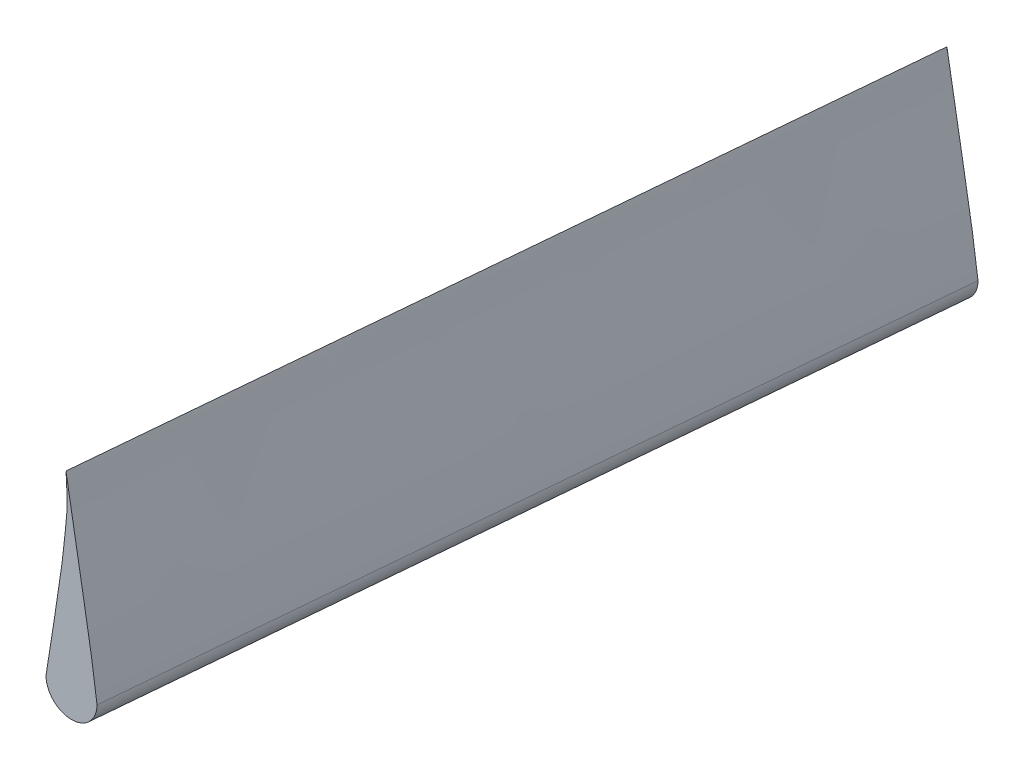
ISO-10303-21;
HEADER;
FILE_DESCRIPTION(('STEP AP214'),'2;1');
FILE_NAME('part.step','',(''),(''),'','','');
FILE_SCHEMA(('AUTOMOTIVE_DESIGN { 1 0 10303 214 1 1 1 1 }'));
ENDSEC;
DATA;
#1=APPLICATION_CONTEXT('core data for automotive mechanical design processes');
#2=APPLICATION_PROTOCOL_DEFINITION('international standard','automotive_design',2000,#1);
#3=PRODUCT_CONTEXT('',#1,'mechanical');
#4=PRODUCT('Part','Part','',(#3));
#5=PRODUCT_RELATED_PRODUCT_CATEGORY('part','',(#4));
#6=PRODUCT_DEFINITION_FORMATION('','',#4);
#7=PRODUCT_DEFINITION_CONTEXT('part definition',#1,'design');
#8=PRODUCT_DEFINITION('design','',#6,#7);
#9=PRODUCT_DEFINITION_SHAPE('','',#8);
#10=(LENGTH_UNIT() NAMED_UNIT(*) SI_UNIT(.MILLI.,.METRE.));
#11=(NAMED_UNIT(*) PLANE_ANGLE_UNIT() SI_UNIT($,.RADIAN.));
#12=(NAMED_UNIT(*) SI_UNIT($,.STERADIAN.) SOLID_ANGLE_UNIT());
#13=UNCERTAINTY_MEASURE_WITH_UNIT(LENGTH_MEASURE(1.E-05),#10,'distance_accuracy_value','');
#14=(GEOMETRIC_REPRESENTATION_CONTEXT(3) GLOBAL_UNCERTAINTY_ASSIGNED_CONTEXT((#13)) GLOBAL_UNIT_ASSIGNED_CONTEXT((#10,
#11,#12)) REPRESENTATION_CONTEXT('',''));
#15=CARTESIAN_POINT('',(0.,0.,0.));
#16=DIRECTION('',(0.,0.,1.));
#17=DIRECTION('',(1.,0.,0.));
#18=AXIS2_PLACEMENT_3D('',#15,#16,#17);
#19=CARTESIAN_POINT('',(15.8488055516127,1622.96621018541,0.));
#20=DIRECTION('',(0.,0.,-1.));
#21=DIRECTION('',(-1.,0.,0.));
#22=AXIS2_PLACEMENT_3D('',#19,#20,#21);
#23=PLANE('',#22);
#24=CARTESIAN_POINT('',(108.163111705416,1062.25747855031,0.));
#25=CARTESIAN_POINT('',(107.796490349262,1065.20905215608,0.));
#26=CARTESIAN_POINT('',(104.514218778771,1091.32278034132,0.));
#27=CARTESIAN_POINT('',(97.6922983253873,1140.53891503912,0.));
#28=CARTESIAN_POINT('',(86.8900465622131,1209.81552897301,0.));
#29=CARTESIAN_POINT('',(75.138452034244,1278.86712759581,0.));
#30=CARTESIAN_POINT('',(62.8377448113715,1348.12449752123,0.));
#31=CARTESIAN_POINT('',(50.6145480312206,1416.01854666511,0.));
#32=CARTESIAN_POINT('',(37.9388449649304,1488.40711009085,0.));
#33=CARTESIAN_POINT('',(28.1057432524615,1543.56861320653,0.));
#34=CARTESIAN_POINT('',(11.2614137888011,1662.85758330789,0.));
#35=CARTESIAN_POINT('',(21.4772260243616,1543.13407332135,0.));
#36=CARTESIAN_POINT('',(14.9162912804117,1487.3237579234,0.));
#37=CARTESIAN_POINT('',(8.69255205173735,1415.12664901814,0.));
#38=CARTESIAN_POINT('',(-0.773079201051988,1347.2963100016,0.));
#39=CARTESIAN_POINT('',(-10.5325328796301,1278.32468444548,0.));
#40=CARTESIAN_POINT('',(-21.5630755964598,1209.5037548012,0.));
#41=CARTESIAN_POINT('',(-32.4731551210363,1141.11506657572,0.));
#42=CARTESIAN_POINT('',(-40.1427423720363,1092.05030975213,0.));
#43=CARTESIAN_POINT('',(-44.1138653947144,1065.76999348616,0.));
#44=CARTESIAN_POINT('',(-44.6420176327897,1062.25747855031,0.));
#45=B_SPLINE_CURVE_WITH_KNOTS('',3,(#24,#25,#26,#27,#28,#29,#30,#31,#32,#33,#34,#35,#36,#37,#38,
#39,#40,#41,#42,#43,#44),.UNSPECIFIED.,.F.,.F.,(4,1,1,1,1,1,1,1,1,1,1,1,1,1,1,1,1,1,4),
(0.799626775710042,0.802790066661639,0.827618886372047,0.852471990587497,0.877337189985559,
0.902189617186733,0.927001991480165,0.951757738434166,0.976444336414281,1.00112539811414,
1.02571177010497,1.05026987366829,1.07486164910205,1.09903169356934,1.1240838565413,
1.14867833551307,1.17323020465844,1.19772082087589,1.20149862240409),.UNSPECIFIED.);
#46=CARTESIAN_POINT('',(108.163111705413,1062.25747855031,0.));
#47=VERTEX_POINT('',#46);
#48=CARTESIAN_POINT('',(-44.6420176327926,1062.25747855031,0.));
#49=VERTEX_POINT('',#48);
#50=EDGE_CURVE('E56',#47,#49,#45,.T.);
#51=ORIENTED_EDGE('',*,*,#50,.F.);
#52=CARTESIAN_POINT('',(31.7605470363104,1062.25747855031,0.));
#53=DIRECTION('',(0.,0.,1.));
#54=DIRECTION('',(1.,0.,0.));
#55=AXIS2_PLACEMENT_3D('',#52,#53,#54);
#56=CIRCLE('',#55,76.402564669103);
#57=EDGE_CURVE('E58',#49,#47,#56,.T.);
#58=ORIENTED_EDGE('',*,*,#57,.F.);
#59=EDGE_LOOP('',(#51,#58));
#60=FACE_BOUND('',#59,.T.);
#61=ADVANCED_FACE('F34',(#60),#23,.T.);
#62=CARTESIAN_POINT('',(18.2927195515977,1844.32718336245,2641.60000000434));
#63=DIRECTION('',(0.,0.,-1.));
#64=DIRECTION('',(-1.,0.,0.));
#65=AXIS2_PLACEMENT_3D('',#62,#63,#64);
#66=PLANE('',#65);
#67=CARTESIAN_POINT('',(110.607025705401,1283.61845172734,2641.60000000434));
#68=CARTESIAN_POINT('',(110.240404349247,1286.57002533312,2641.60000000434));
#69=CARTESIAN_POINT('',(106.958132778756,1312.68375351835,2641.60000000434));
#70=CARTESIAN_POINT('',(100.136212325372,1361.89988821616,2641.60000000434));
#71=CARTESIAN_POINT('',(89.3339605621982,1431.17650215005,2641.60000000434));
#72=CARTESIAN_POINT('',(77.582366034229,1500.22810077285,2641.60000000434));
#73=CARTESIAN_POINT('',(65.2816588113565,1569.48547069826,2641.60000000434));
#74=CARTESIAN_POINT('',(53.0584620312056,1637.37951984214,2641.60000000434));
#75=CARTESIAN_POINT('',(40.3827589649154,1709.76808326789,2641.60000000434));
#76=CARTESIAN_POINT('',(30.5496572524466,1764.92958638357,2641.60000000434));
#77=CARTESIAN_POINT('',(13.7053277887861,1884.21855648493,2641.60000000434));
#78=CARTESIAN_POINT('',(23.9211400243466,1764.49504649839,2641.60000000434));
#79=CARTESIAN_POINT('',(17.3602052803967,1708.68473110043,2641.60000000434));
#80=CARTESIAN_POINT('',(11.1364660517224,1636.48762219518,2641.60000000434));
#81=CARTESIAN_POINT('',(1.67083479893303,1568.65728317864,2641.60000000434));
#82=CARTESIAN_POINT('',(-8.08861887964504,1499.68565762252,2641.60000000434));
#83=CARTESIAN_POINT('',(-19.1191615964748,1430.86472797824,2641.60000000434));
#84=CARTESIAN_POINT('',(-30.0292411210512,1362.47603975276,2641.60000000434));
#85=CARTESIAN_POINT('',(-37.6988283720513,1313.41128292917,2641.60000000434));
#86=CARTESIAN_POINT('',(-41.6699513947293,1287.1309666632,2641.60000000434));
#87=CARTESIAN_POINT('',(-42.1981036328047,1283.61845172735,2641.60000000434));
#88=B_SPLINE_CURVE_WITH_KNOTS('',3,(#67,#68,#69,#70,#71,#72,#73,#74,#75,#76,#77,#78,#79,#80,#81,
#82,#83,#84,#85,#86,#87),.UNSPECIFIED.,.F.,.F.,(4,1,1,1,1,1,1,1,1,1,1,1,1,1,1,1,1,1,4),
(0.799626775710042,0.802790066661639,0.827618886372047,0.852471990587497,0.877337189985559,
0.902189617186733,0.927001991480165,0.951757738434166,0.976444336414281,1.00112539811414,
1.02571177010497,1.05026987366829,1.07486164910205,1.09903169356934,1.1240838565413,
1.14867833551307,1.17323020465844,1.19772082087589,1.20149862240409),.UNSPECIFIED.);
#89=CARTESIAN_POINT('',(110.607025705398,1283.61845172735,2641.60000000434));
#90=VERTEX_POINT('',#89);
#91=CARTESIAN_POINT('',(-42.1981036328076,1283.61845172735,2641.60000000434));
#92=VERTEX_POINT('',#91);
#93=EDGE_CURVE('E46',#90,#92,#88,.T.);
#94=ORIENTED_EDGE('',*,*,#93,.T.);
#95=CARTESIAN_POINT('',(34.2044610362955,1283.61845172735,2641.60000000434));
#96=DIRECTION('',(0.,0.,1.));
#97=DIRECTION('',(1.,0.,0.));
#98=AXIS2_PLACEMENT_3D('',#95,#96,#97);
#99=CIRCLE('',#98,76.402564669103);
#100=EDGE_CURVE('E11',#92,#90,#99,.T.);
#101=ORIENTED_EDGE('',*,*,#100,.T.);
#102=EDGE_LOOP('',(#94,#101));
#103=FACE_BOUND('',#102,.T.);
#104=ADVANCED_FACE('F83',(#103),#66,.F.);
#105=CARTESIAN_POINT('',(108.163111705416,1062.25747855031,0.));
#106=CARTESIAN_POINT('',(110.607025705401,1283.61845172734,2641.60000000434));
#107=CARTESIAN_POINT('',(107.796490349262,1065.20905215608,0.));
#108=CARTESIAN_POINT('',(110.240404349247,1286.57002533312,2641.60000000434));
#109=CARTESIAN_POINT('',(104.514218778771,1091.32278034132,0.));
#110=CARTESIAN_POINT('',(106.958132778756,1312.68375351835,2641.60000000434));
#111=CARTESIAN_POINT('',(97.6922983253873,1140.53891503912,0.));
#112=CARTESIAN_POINT('',(100.136212325372,1361.89988821616,2641.60000000434));
#113=CARTESIAN_POINT('',(86.8900465622131,1209.81552897301,0.));
#114=CARTESIAN_POINT('',(89.3339605621982,1431.17650215005,2641.60000000434));
#115=CARTESIAN_POINT('',(75.138452034244,1278.86712759581,0.));
#116=CARTESIAN_POINT('',(77.582366034229,1500.22810077285,2641.60000000434));
#117=CARTESIAN_POINT('',(62.8377448113715,1348.12449752123,0.));
#118=CARTESIAN_POINT('',(65.2816588113565,1569.48547069826,2641.60000000434));
#119=CARTESIAN_POINT('',(50.6145480312206,1416.01854666511,0.));
#120=CARTESIAN_POINT('',(53.0584620312056,1637.37951984214,2641.60000000434));
#121=CARTESIAN_POINT('',(37.9388449649304,1488.40711009085,0.));
#122=CARTESIAN_POINT('',(40.3827589649154,1709.76808326789,2641.60000000434));
#123=CARTESIAN_POINT('',(28.1057432524615,1543.56861320653,0.));
#124=CARTESIAN_POINT('',(30.5496572524466,1764.92958638357,2641.60000000434));
#125=CARTESIAN_POINT('',(11.2614137888011,1662.85758330789,0.));
#126=CARTESIAN_POINT('',(13.7053277887861,1884.21855648493,2641.60000000434));
#127=CARTESIAN_POINT('',(21.4772260243616,1543.13407332135,0.));
#128=CARTESIAN_POINT('',(23.9211400243466,1764.49504649839,2641.60000000434));
#129=CARTESIAN_POINT('',(14.9162912804117,1487.3237579234,0.));
#130=CARTESIAN_POINT('',(17.3602052803967,1708.68473110043,2641.60000000434));
#131=CARTESIAN_POINT('',(8.69255205173735,1415.12664901814,0.));
#132=CARTESIAN_POINT('',(11.1364660517224,1636.48762219518,2641.60000000434));
#133=CARTESIAN_POINT('',(-0.773079201051988,1347.2963100016,0.));
#134=CARTESIAN_POINT('',(1.67083479893303,1568.65728317864,2641.60000000434));
#135=CARTESIAN_POINT('',(-10.5325328796301,1278.32468444548,0.));
#136=CARTESIAN_POINT('',(-8.08861887964504,1499.68565762252,2641.60000000434));
#137=CARTESIAN_POINT('',(-21.5630755964598,1209.5037548012,0.));
#138=CARTESIAN_POINT('',(-19.1191615964748,1430.86472797824,2641.60000000434));
#139=CARTESIAN_POINT('',(-32.4731551210363,1141.11506657572,0.));
#140=CARTESIAN_POINT('',(-30.0292411210512,1362.47603975276,2641.60000000434));
#141=CARTESIAN_POINT('',(-40.1427423720363,1092.05030975213,0.));
#142=CARTESIAN_POINT('',(-37.6988283720513,1313.41128292917,2641.60000000434));
#143=CARTESIAN_POINT('',(-44.1138653947144,1065.76999348616,0.));
#144=CARTESIAN_POINT('',(-41.6699513947293,1287.1309666632,2641.60000000434));
#145=CARTESIAN_POINT('',(-44.6420176327897,1062.25747855031,0.));
#146=CARTESIAN_POINT('',(-42.1981036328047,1283.61845172735,2641.60000000434));
#147=B_SPLINE_SURFACE_WITH_KNOTS('',3,1,((#105,#106),(#107,#108),(#109,#110),(#111,#112),(#113,
#114),(#115,#116),(#117,#118),(#119,#120),(#121,#122),(#123,#124),(#125,#126),(#127,#128),(#129,
#130),(#131,#132),(#133,#134),(#135,#136),(#137,#138),(#139,#140),(#141,#142),(#143,#144),(#145,
#146)),.UNSPECIFIED.,.F.,.F.,.F.,(4,1,1,1,1,1,1,1,1,1,1,1,1,1,1,1,1,1,4),(2,2),(0.,
0.00787139227994897,0.0696543211281856,0.131497678456899,0.193371132899185,0.255212805575736,
0.316954812381008,0.37855591023758,0.439984940868104,0.501400195265474,0.562579828009317,
0.623689118857486,0.684882197288004,0.745025859169581,0.807364545439957,0.868564351233988,
0.92965812863428,0.990599486977548,1.),(0.,1.),.UNSPECIFIED.);
#148=DIRECTION('',(0.000921932605048242,0.0835053519307023,0.996506902253668));
#149=VECTOR('',#148,1.);
#150=CARTESIAN_POINT('',(-44.6420176327926,1062.25747855031,0.));
#151=LINE('',#150,#149);
#152=EDGE_CURVE('E41',#49,#92,#151,.T.);
#153=DIRECTION('',(0.000921932605048242,0.0835053519307023,0.996506902253668));
#154=VECTOR('',#153,1.);
#155=CARTESIAN_POINT('',(108.163111705413,1062.25747855031,0.));
#156=LINE('',#155,#154);
#157=EDGE_CURVE('E67',#47,#90,#156,.T.);
#158=ORIENTED_EDGE('',*,*,#152,.T.);
#159=ORIENTED_EDGE('',*,*,#93,.F.);
#160=ORIENTED_EDGE('',*,*,#157,.F.);
#161=ORIENTED_EDGE('',*,*,#50,.T.);
#162=EDGE_LOOP('',(#158,#159,#160,#161));
#163=FACE_BOUND('',#162,.T.);
#164=ADVANCED_FACE('F68',(#163),#147,.T.);
#165=CARTESIAN_POINT('',(-44.6420176327926,1062.25747855031,0.));
#166=CARTESIAN_POINT('',(-42.1981036328076,1283.61845172735,2641.60000000434));
#167=CARTESIAN_POINT('',(-44.6420176327873,909.452349212108,0.));
#168=CARTESIAN_POINT('',(-42.1981036328023,1130.81332238914,2641.60000000434));
#169=CARTESIAN_POINT('',(108.163111705413,909.452349212111,0.));
#170=CARTESIAN_POINT('',(110.607025705398,1130.81332238915,2641.60000000434));
#171=CARTESIAN_POINT('',(108.163111705413,1062.25747855031,0.));
#172=CARTESIAN_POINT('',(110.607025705398,1283.61845172735,2641.60000000434));
#173=(BOUNDED_SURFACE() B_SPLINE_SURFACE(3,1,((#165,#166),(#167,#168),(#169,#170),(#171,#172)),
.UNSPECIFIED.,.F.,.F.,.F.) B_SPLINE_SURFACE_WITH_KNOTS((4,4),(2,2),(0.,1.),(0.,1.),
.UNSPECIFIED.) GEOMETRIC_REPRESENTATION_ITEM() RATIONAL_B_SPLINE_SURFACE(((1.,1.),
(0.333333333333345,0.333333333333345),(0.333333333333345,0.333333333333345),(1.,1.))) REPRESENTATION_ITEM('') SURFACE());
#174=ORIENTED_EDGE('',*,*,#100,.F.);
#175=ORIENTED_EDGE('',*,*,#152,.F.);
#176=ORIENTED_EDGE('',*,*,#57,.T.);
#177=ORIENTED_EDGE('',*,*,#157,.T.);
#178=EDGE_LOOP('',(#174,#175,#176,#177));
#179=FACE_BOUND('',#178,.T.);
#180=ADVANCED_FACE('F66',(#179),#173,.T.);
#181=CLOSED_SHELL('',(#61,#104,#164,#180));
#182=MANIFOLD_SOLID_BREP('B2',#181);
#183=ADVANCED_BREP_SHAPE_REPRESENTATION('',(#18,#182),#14);
#184=SHAPE_DEFINITION_REPRESENTATION(#9,#183);
ENDSEC;
END-ISO-10303-21;
